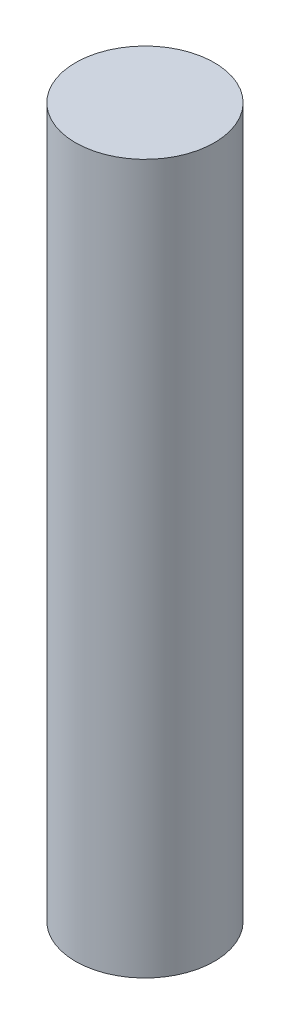
ISO-10303-21;
HEADER;
FILE_DESCRIPTION(('STEP AP214'),'2;1');
FILE_NAME('part.step','',(''),(''),'','','');
FILE_SCHEMA(('AUTOMOTIVE_DESIGN { 1 0 10303 214 1 1 1 1 }'));
ENDSEC;
DATA;
#1=APPLICATION_CONTEXT('core data for automotive mechanical design processes');
#2=APPLICATION_PROTOCOL_DEFINITION('international standard','automotive_design',2000,#1);
#3=PRODUCT_CONTEXT('',#1,'mechanical');
#4=PRODUCT('Part','Part','',(#3));
#5=PRODUCT_RELATED_PRODUCT_CATEGORY('part','',(#4));
#6=PRODUCT_DEFINITION_FORMATION('','',#4);
#7=PRODUCT_DEFINITION_CONTEXT('part definition',#1,'design');
#8=PRODUCT_DEFINITION('design','',#6,#7);
#9=PRODUCT_DEFINITION_SHAPE('','',#8);
#10=(LENGTH_UNIT() NAMED_UNIT(*) SI_UNIT(.MILLI.,.METRE.));
#11=(NAMED_UNIT(*) PLANE_ANGLE_UNIT() SI_UNIT($,.RADIAN.));
#12=(NAMED_UNIT(*) SI_UNIT($,.STERADIAN.) SOLID_ANGLE_UNIT());
#13=UNCERTAINTY_MEASURE_WITH_UNIT(LENGTH_MEASURE(1.E-05),#10,'distance_accuracy_value','');
#14=(GEOMETRIC_REPRESENTATION_CONTEXT(3) GLOBAL_UNCERTAINTY_ASSIGNED_CONTEXT((#13)) GLOBAL_UNIT_ASSIGNED_CONTEXT((#10,
#11,#12)) REPRESENTATION_CONTEXT('',''));
#15=CARTESIAN_POINT('',(0.,0.,0.));
#16=DIRECTION('',(0.,0.,1.));
#17=DIRECTION('',(1.,0.,0.));
#18=AXIS2_PLACEMENT_3D('',#15,#16,#17);
#19=CARTESIAN_POINT('',(0.,24.,0.));
#20=DIRECTION('',(0.,-1.,0.));
#21=DIRECTION('',(0.,0.,-1.));
#22=AXIS2_PLACEMENT_3D('',#19,#20,#21);
#23=CYLINDRICAL_SURFACE('',#22,2.35);
#24=CARTESIAN_POINT('',(0.,24.,0.));
#25=DIRECTION('',(0.,1.,0.));
#26=DIRECTION('',(0.,0.,1.));
#27=AXIS2_PLACEMENT_3D('',#24,#25,#26);
#28=CIRCLE('',#27,2.35);
#29=CARTESIAN_POINT('',(0.,24.,2.35));
#30=VERTEX_POINT('',#29);
#31=EDGE_CURVE('E10',#30,#30,#28,.T.);
#32=ORIENTED_EDGE('',*,*,#31,.F.);
#33=EDGE_LOOP('',(#32));
#34=FACE_BOUND('',#33,.T.);
#35=CARTESIAN_POINT('',(0.,0.,0.));
#36=DIRECTION('',(0.,1.,0.));
#37=DIRECTION('',(0.,0.,1.));
#38=AXIS2_PLACEMENT_3D('',#35,#36,#37);
#39=CIRCLE('',#38,2.35);
#40=CARTESIAN_POINT('',(0.,0.,2.35));
#41=VERTEX_POINT('',#40);
#42=EDGE_CURVE('E34',#41,#41,#39,.T.);
#43=ORIENTED_EDGE('',*,*,#42,.T.);
#44=EDGE_LOOP('',(#43));
#45=FACE_BOUND('',#44,.T.);
#46=ADVANCED_FACE('F31',(#34,#45),#23,.T.);
#47=CARTESIAN_POINT('',(0.,24.,0.));
#48=DIRECTION('',(0.,1.,0.));
#49=DIRECTION('',(0.,0.,1.));
#50=AXIS2_PLACEMENT_3D('',#47,#48,#49);
#51=PLANE('',#50);
#52=ORIENTED_EDGE('',*,*,#31,.T.);
#53=EDGE_LOOP('',(#52));
#54=FACE_BOUND('',#53,.T.);
#55=ADVANCED_FACE('F46',(#54),#51,.T.);
#56=CARTESIAN_POINT('',(0.,0.,0.));
#57=DIRECTION('',(0.,1.,0.));
#58=DIRECTION('',(0.,0.,1.));
#59=AXIS2_PLACEMENT_3D('',#56,#57,#58);
#60=PLANE('',#59);
#61=ORIENTED_EDGE('',*,*,#42,.F.);
#62=EDGE_LOOP('',(#61));
#63=FACE_BOUND('',#62,.T.);
#64=ADVANCED_FACE('F44',(#63),#60,.F.);
#65=CLOSED_SHELL('',(#46,#55,#64));
#66=MANIFOLD_SOLID_BREP('B2',#65);
#67=ADVANCED_BREP_SHAPE_REPRESENTATION('',(#18,#66),#14);
#68=SHAPE_DEFINITION_REPRESENTATION(#9,#67);
ENDSEC;
END-ISO-10303-21;
